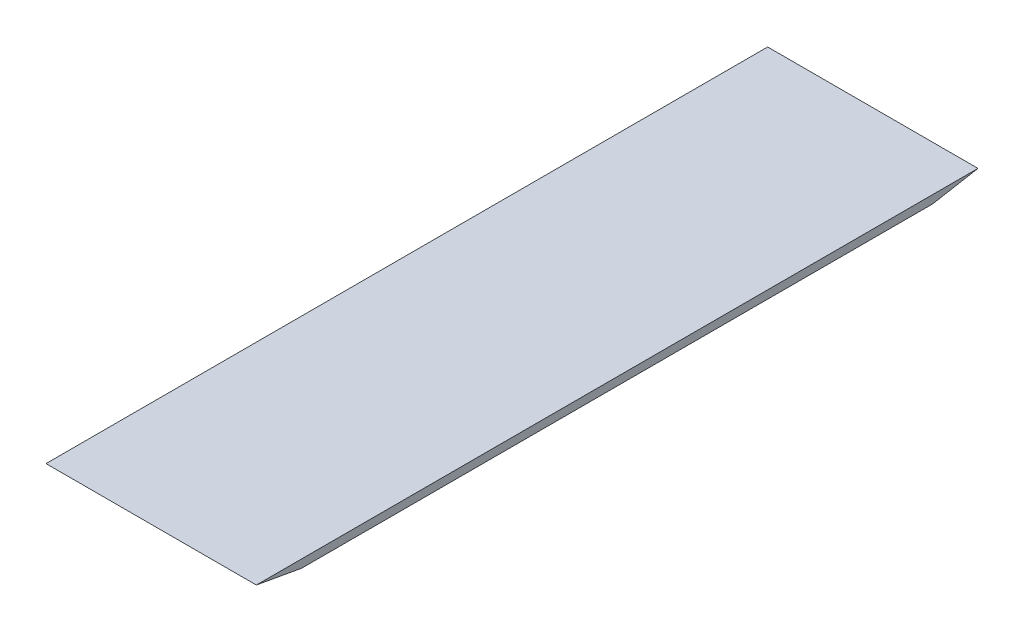
ISO-10303-21;
HEADER;
FILE_DESCRIPTION(('STEP AP214'),'2;1');
FILE_NAME('part.step','',(''),(''),'','','');
FILE_SCHEMA(('AUTOMOTIVE_DESIGN { 1 0 10303 214 1 1 1 1 }'));
ENDSEC;
DATA;
#1=APPLICATION_CONTEXT('core data for automotive mechanical design processes');
#2=APPLICATION_PROTOCOL_DEFINITION('international standard','automotive_design',2000,#1);
#3=PRODUCT_CONTEXT('',#1,'mechanical');
#4=PRODUCT('Part','Part','',(#3));
#5=PRODUCT_RELATED_PRODUCT_CATEGORY('part','',(#4));
#6=PRODUCT_DEFINITION_FORMATION('','',#4);
#7=PRODUCT_DEFINITION_CONTEXT('part definition',#1,'design');
#8=PRODUCT_DEFINITION('design','',#6,#7);
#9=PRODUCT_DEFINITION_SHAPE('','',#8);
#10=(LENGTH_UNIT() NAMED_UNIT(*) SI_UNIT(.MILLI.,.METRE.));
#11=(NAMED_UNIT(*) PLANE_ANGLE_UNIT() SI_UNIT($,.RADIAN.));
#12=(NAMED_UNIT(*) SI_UNIT($,.STERADIAN.) SOLID_ANGLE_UNIT());
#13=UNCERTAINTY_MEASURE_WITH_UNIT(LENGTH_MEASURE(1.E-05),#10,'distance_accuracy_value','');
#14=(GEOMETRIC_REPRESENTATION_CONTEXT(3) GLOBAL_UNCERTAINTY_ASSIGNED_CONTEXT((#13)) GLOBAL_UNIT_ASSIGNED_CONTEXT((#10,
#11,#12)) REPRESENTATION_CONTEXT('',''));
#15=CARTESIAN_POINT('',(0.,0.,0.));
#16=DIRECTION('',(0.,0.,1.));
#17=DIRECTION('',(1.,0.,0.));
#18=AXIS2_PLACEMENT_3D('',#15,#16,#17);
#19=CARTESIAN_POINT('',(130.,0.,-446.));
#20=DIRECTION('',(0.,-0.984427575508482,-0.175790638483657));
#21=DIRECTION('',(0.,0.175790638483657,-0.984427575508482));
#22=AXIS2_PLACEMENT_3D('',#19,#20,#21);
#23=PLANE('',#22);
#24=DIRECTION('',(0.,-0.175790638483657,0.984427575508482));
#25=VECTOR('',#24,1.);
#26=CARTESIAN_POINT('',(0.,0.,-446.));
#27=LINE('',#26,#25);
#28=CARTESIAN_POINT('',(0.,0.,-446.));
#29=VERTEX_POINT('',#28);
#30=CARTESIAN_POINT('',(0.,-5.,-418.));
#31=VERTEX_POINT('',#30);
#32=EDGE_CURVE('E109',#29,#31,#27,.T.);
#33=ORIENTED_EDGE('',*,*,#32,.F.);
#34=DIRECTION('',(-1.,0.,0.));
#35=VECTOR('',#34,1.);
#36=CARTESIAN_POINT('',(130.,0.,-446.));
#37=LINE('',#36,#35);
#38=CARTESIAN_POINT('',(130.,0.,-446.));
#39=VERTEX_POINT('',#38);
#40=EDGE_CURVE('E11',#39,#29,#37,.T.);
#41=ORIENTED_EDGE('',*,*,#40,.F.);
#42=DIRECTION('',(0.,-0.175790638483657,0.984427575508482));
#43=VECTOR('',#42,1.);
#44=CARTESIAN_POINT('',(130.,0.,-446.));
#45=LINE('',#44,#43);
#46=CARTESIAN_POINT('',(130.,-5.,-418.));
#47=VERTEX_POINT('',#46);
#48=EDGE_CURVE('E101',#39,#47,#45,.T.);
#49=ORIENTED_EDGE('',*,*,#48,.T.);
#50=DIRECTION('',(-1.,0.,0.));
#51=VECTOR('',#50,1.);
#52=CARTESIAN_POINT('',(130.,-5.,-418.));
#53=LINE('',#52,#51);
#54=EDGE_CURVE('E42',#47,#31,#53,.T.);
#55=ORIENTED_EDGE('',*,*,#54,.T.);
#56=EDGE_LOOP('',(#33,#41,#49,#55));
#57=FACE_BOUND('',#56,.T.);
#58=ADVANCED_FACE('F39',(#57),#23,.T.);
#59=CARTESIAN_POINT('',(130.,0.,0.));
#60=DIRECTION('',(0.,1.,0.));
#61=DIRECTION('',(0.,0.,1.));
#62=AXIS2_PLACEMENT_3D('',#59,#60,#61);
#63=PLANE('',#62);
#64=DIRECTION('',(0.,0.,-1.));
#65=VECTOR('',#64,1.);
#66=CARTESIAN_POINT('',(0.,0.,0.));
#67=LINE('',#66,#65);
#68=CARTESIAN_POINT('',(0.,0.,0.));
#69=VERTEX_POINT('',#68);
#70=EDGE_CURVE('E104',#69,#29,#67,.T.);
#71=ORIENTED_EDGE('',*,*,#70,.F.);
#72=DIRECTION('',(-1.,0.,0.));
#73=VECTOR('',#72,1.);
#74=CARTESIAN_POINT('',(130.,0.,0.));
#75=LINE('',#74,#73);
#76=CARTESIAN_POINT('',(130.,0.,0.));
#77=VERTEX_POINT('',#76);
#78=EDGE_CURVE('E49',#77,#69,#75,.T.);
#79=ORIENTED_EDGE('',*,*,#78,.F.);
#80=DIRECTION('',(0.,0.,-1.));
#81=VECTOR('',#80,1.);
#82=CARTESIAN_POINT('',(130.,0.,0.));
#83=LINE('',#82,#81);
#84=EDGE_CURVE('E96',#77,#39,#83,.T.);
#85=ORIENTED_EDGE('',*,*,#84,.T.);
#86=ORIENTED_EDGE('',*,*,#40,.T.);
#87=EDGE_LOOP('',(#71,#79,#85,#86));
#88=FACE_BOUND('',#87,.T.);
#89=ADVANCED_FACE('F125',(#88),#63,.T.);
#90=CARTESIAN_POINT('',(130.,-5.00000000000005,-28.));
#91=DIRECTION('',(0.,-0.984427575508482,0.175790638483659));
#92=DIRECTION('',(0.,-0.175790638483659,-0.984427575508482));
#93=AXIS2_PLACEMENT_3D('',#90,#91,#92);
#94=PLANE('',#93);
#95=DIRECTION('',(0.,0.175790638483659,0.984427575508482));
#96=VECTOR('',#95,1.);
#97=CARTESIAN_POINT('',(0.,-5.00000000000005,-28.));
#98=LINE('',#97,#96);
#99=CARTESIAN_POINT('',(0.,-5.00000000000005,-28.));
#100=VERTEX_POINT('',#99);
#101=EDGE_CURVE('E90',#100,#69,#98,.T.);
#102=ORIENTED_EDGE('',*,*,#101,.F.);
#103=DIRECTION('',(-1.,0.,0.));
#104=VECTOR('',#103,1.);
#105=CARTESIAN_POINT('',(130.,-5.00000000000005,-28.));
#106=LINE('',#105,#104);
#107=CARTESIAN_POINT('',(130.,-5.00000000000005,-28.));
#108=VERTEX_POINT('',#107);
#109=EDGE_CURVE('E85',#108,#100,#106,.T.);
#110=ORIENTED_EDGE('',*,*,#109,.F.);
#111=DIRECTION('',(0.,0.175790638483659,0.984427575508482));
#112=VECTOR('',#111,1.);
#113=CARTESIAN_POINT('',(130.,-5.00000000000005,-28.));
#114=LINE('',#113,#112);
#115=EDGE_CURVE('E88',#108,#77,#114,.T.);
#116=ORIENTED_EDGE('',*,*,#115,.T.);
#117=ORIENTED_EDGE('',*,*,#78,.T.);
#118=EDGE_LOOP('',(#102,#110,#116,#117));
#119=FACE_BOUND('',#118,.T.);
#120=ADVANCED_FACE('F87',(#119),#94,.T.);
#121=CARTESIAN_POINT('',(130.,-5.,-418.));
#122=DIRECTION('',(0.,-1.,0.));
#123=DIRECTION('',(0.,0.,-1.));
#124=AXIS2_PLACEMENT_3D('',#121,#122,#123);
#125=PLANE('',#124);
#126=DIRECTION('',(0.,0.,1.));
#127=VECTOR('',#126,1.);
#128=CARTESIAN_POINT('',(0.,-5.,-418.));
#129=LINE('',#128,#127);
#130=EDGE_CURVE('E113',#31,#100,#129,.T.);
#131=ORIENTED_EDGE('',*,*,#130,.F.);
#132=ORIENTED_EDGE('',*,*,#54,.F.);
#133=DIRECTION('',(0.,0.,1.));
#134=VECTOR('',#133,1.);
#135=CARTESIAN_POINT('',(130.,-5.,-418.));
#136=LINE('',#135,#134);
#137=EDGE_CURVE('E95',#47,#108,#136,.T.);
#138=ORIENTED_EDGE('',*,*,#137,.T.);
#139=ORIENTED_EDGE('',*,*,#109,.T.);
#140=EDGE_LOOP('',(#131,#132,#138,#139));
#141=FACE_BOUND('',#140,.T.);
#142=ADVANCED_FACE('F99',(#141),#125,.T.);
#143=CARTESIAN_POINT('',(130.,0.,0.));
#144=DIRECTION('',(-1.,0.,0.));
#145=DIRECTION('',(0.,0.,1.));
#146=AXIS2_PLACEMENT_3D('',#143,#144,#145);
#147=PLANE('',#146);
#148=ORIENTED_EDGE('',*,*,#48,.F.);
#149=ORIENTED_EDGE('',*,*,#84,.F.);
#150=ORIENTED_EDGE('',*,*,#115,.F.);
#151=ORIENTED_EDGE('',*,*,#137,.F.);
#152=EDGE_LOOP('',(#148,#149,#150,#151));
#153=FACE_BOUND('',#152,.T.);
#154=ADVANCED_FACE('F94',(#153),#147,.F.);
#155=CARTESIAN_POINT('',(0.,0.,0.));
#156=DIRECTION('',(-1.,0.,0.));
#157=DIRECTION('',(0.,0.,1.));
#158=AXIS2_PLACEMENT_3D('',#155,#156,#157);
#159=PLANE('',#158);
#160=ORIENTED_EDGE('',*,*,#32,.T.);
#161=ORIENTED_EDGE('',*,*,#130,.T.);
#162=ORIENTED_EDGE('',*,*,#101,.T.);
#163=ORIENTED_EDGE('',*,*,#70,.T.);
#164=EDGE_LOOP('',(#160,#161,#162,#163));
#165=FACE_BOUND('',#164,.T.);
#166=ADVANCED_FACE('F124',(#165),#159,.T.);
#167=CLOSED_SHELL('',(#58,#89,#120,#142,#154,#166));
#168=MANIFOLD_SOLID_BREP('B2',#167);
#169=ADVANCED_BREP_SHAPE_REPRESENTATION('',(#18,#168),#14);
#170=SHAPE_DEFINITION_REPRESENTATION(#9,#169);
ENDSEC;
END-ISO-10303-21;
